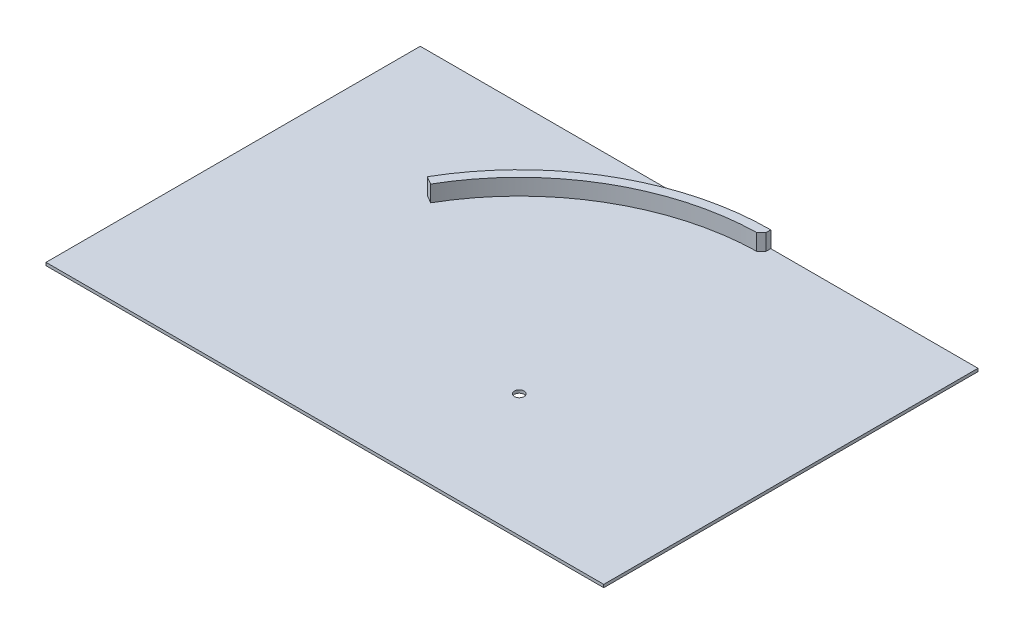
ISO-10303-21;
HEADER;
FILE_DESCRIPTION(('STEP AP214'),'2;1');
FILE_NAME('part.step','',(''),(''),'','','');
FILE_SCHEMA(('AUTOMOTIVE_DESIGN { 1 0 10303 214 1 1 1 1 }'));
ENDSEC;
DATA;
#1=APPLICATION_CONTEXT('core data for automotive mechanical design processes');
#2=APPLICATION_PROTOCOL_DEFINITION('international standard','automotive_design',2000,#1);
#3=PRODUCT_CONTEXT('',#1,'mechanical');
#4=PRODUCT('Part','Part','',(#3));
#5=PRODUCT_RELATED_PRODUCT_CATEGORY('part','',(#4));
#6=PRODUCT_DEFINITION_FORMATION('','',#4);
#7=PRODUCT_DEFINITION_CONTEXT('part definition',#1,'design');
#8=PRODUCT_DEFINITION('design','',#6,#7);
#9=PRODUCT_DEFINITION_SHAPE('','',#8);
#10=(LENGTH_UNIT() NAMED_UNIT(*) SI_UNIT(.MILLI.,.METRE.));
#11=(NAMED_UNIT(*) PLANE_ANGLE_UNIT() SI_UNIT($,.RADIAN.));
#12=(NAMED_UNIT(*) SI_UNIT($,.STERADIAN.) SOLID_ANGLE_UNIT());
#13=UNCERTAINTY_MEASURE_WITH_UNIT(LENGTH_MEASURE(1.E-05),#10,'distance_accuracy_value','');
#14=(GEOMETRIC_REPRESENTATION_CONTEXT(3) GLOBAL_UNCERTAINTY_ASSIGNED_CONTEXT((#13)) GLOBAL_UNIT_ASSIGNED_CONTEXT((#10,
#11,#12)) REPRESENTATION_CONTEXT('',''));
#15=CARTESIAN_POINT('',(0.,0.,0.));
#16=DIRECTION('',(0.,0.,1.));
#17=DIRECTION('',(1.,0.,0.));
#18=AXIS2_PLACEMENT_3D('',#15,#16,#17);
#19=CARTESIAN_POINT('',(0.,0.,0.));
#20=DIRECTION('',(0.,-1.,0.));
#21=DIRECTION('',(0.,0.,-1.));
#22=AXIS2_PLACEMENT_3D('',#19,#20,#21);
#23=PLANE('',#22);
#24=CARTESIAN_POINT('',(0.,0.,0.));
#25=DIRECTION('',(0.,-1.,0.));
#26=DIRECTION('',(0.,0.,1.));
#27=AXIS2_PLACEMENT_3D('',#24,#25,#26);
#28=CIRCLE('',#27,521.);
#29=CARTESIAN_POINT('',(-451.199235371692,0.,-260.5));
#30=VERTEX_POINT('',#29);
#31=CARTESIAN_POINT('',(-10.0978661013187,0.,-520.902133898681));
#32=VERTEX_POINT('',#31);
#33=EDGE_CURVE('E171',#30,#32,#28,.T.);
#34=ORIENTED_EDGE('',*,*,#33,.F.);
#35=DIRECTION('',(0.866025403784435,0.,0.500000000000006));
#36=VECTOR('',#35,1.);
#37=CARTESIAN_POINT('',(-468.519743447381,0.,-270.500000000001));
#38=LINE('',#37,#36);
#39=CARTESIAN_POINT('',(-468.519743447381,0.,-270.500000000001));
#40=VERTEX_POINT('',#39);
#41=EDGE_CURVE('E181',#40,#30,#38,.T.);
#42=ORIENTED_EDGE('',*,*,#41,.F.);
#43=CARTESIAN_POINT('',(0.,0.,0.));
#44=DIRECTION('',(0.,1.,0.));
#45=DIRECTION('',(0.,0.,1.));
#46=AXIS2_PLACEMENT_3D('',#43,#44,#45);
#47=CIRCLE('',#46,541.);
#48=CARTESIAN_POINT('',(0.,0.,-541.));
#49=VERTEX_POINT('',#48);
#50=EDGE_CURVE('E196',#49,#40,#47,.T.);
#51=ORIENTED_EDGE('',*,*,#50,.F.);
#52=DIRECTION('',(-1.,0.,0.));
#53=VECTOR('',#52,1.);
#54=CARTESIAN_POINT('',(-754.139235371692,0.,-541.));
#55=LINE('',#54,#53);
#56=CARTESIAN_POINT('',(-754.139235371692,0.,-541.));
#57=VERTEX_POINT('',#56);
#58=EDGE_CURVE('E150',#49,#57,#55,.T.);
#59=ORIENTED_EDGE('',*,*,#58,.T.);
#60=DIRECTION('',(0.,0.,1.));
#61=VECTOR('',#60,1.);
#62=CARTESIAN_POINT('',(-754.139235371692,0.,264.2));
#63=LINE('',#62,#61);
#64=CARTESIAN_POINT('',(-754.139235371692,0.,264.2));
#65=VERTEX_POINT('',#64);
#66=EDGE_CURVE('E160',#57,#65,#63,.T.);
#67=ORIENTED_EDGE('',*,*,#66,.T.);
#68=DIRECTION('',(1.,0.,0.));
#69=VECTOR('',#68,1.);
#70=CARTESIAN_POINT('',(-754.139235371692,0.,264.2));
#71=LINE('',#70,#69);
#72=CARTESIAN_POINT('',(445.860764628308,0.,264.2));
#73=VERTEX_POINT('',#72);
#74=EDGE_CURVE('E122',#65,#73,#71,.T.);
#75=ORIENTED_EDGE('',*,*,#74,.T.);
#76=DIRECTION('',(0.,0.,-1.));
#77=VECTOR('',#76,1.);
#78=CARTESIAN_POINT('',(445.860764628308,0.,264.2));
#79=LINE('',#78,#77);
#80=CARTESIAN_POINT('',(445.860764628308,0.,-541.));
#81=VERTEX_POINT('',#80);
#82=EDGE_CURVE('E165',#73,#81,#79,.T.);
#83=ORIENTED_EDGE('',*,*,#82,.T.);
#84=EDGE_CURVE('E146',#81,#49,#55,.T.);
#85=ORIENTED_EDGE('',*,*,#84,.T.);
#86=DIRECTION('',(0.,0.,-1.));
#87=VECTOR('',#86,1.);
#88=CARTESIAN_POINT('',(0.,0.,-541.));
#89=LINE('',#88,#87);
#90=CARTESIAN_POINT('',(0.,0.,-531.));
#91=VERTEX_POINT('',#90);
#92=EDGE_CURVE('E193',#91,#49,#89,.T.);
#93=ORIENTED_EDGE('',*,*,#92,.F.);
#94=DIRECTION('',(0.70710678118654,0.,-0.707106781186555));
#95=VECTOR('',#94,1.);
#96=CARTESIAN_POINT('',(-265.5,0.,-265.499999999995));
#97=LINE('',#96,#95);
#98=EDGE_CURVE('E11',#91,#32,#97,.F.);
#99=ORIENTED_EDGE('',*,*,#98,.T.);
#100=EDGE_LOOP('',(#34,#42,#51,#59,#67,#75,#83,#85,#93,#99));
#101=FACE_BOUND('',#100,.T.);
#102=CARTESIAN_POINT('',(0.,0.,0.));
#103=DIRECTION('',(0.,1.,0.));
#104=DIRECTION('',(0.,0.,1.));
#105=AXIS2_PLACEMENT_3D('',#102,#103,#104);
#106=CIRCLE('',#105,10.5);
#107=CARTESIAN_POINT('',(0.,0.,10.5));
#108=VERTEX_POINT('',#107);
#109=EDGE_CURVE('E382',#108,#108,#106,.T.);
#110=ORIENTED_EDGE('',*,*,#109,.F.);
#111=EDGE_LOOP('',(#110));
#112=FACE_BOUND('',#111,.T.);
#113=ADVANCED_FACE('F45',(#101,#112),#23,.F.);
#114=CARTESIAN_POINT('',(0.,35.,0.));
#115=DIRECTION('',(0.,-1.,0.));
#116=DIRECTION('',(0.,0.,-1.));
#117=AXIS2_PLACEMENT_3D('',#114,#115,#116);
#118=CYLINDRICAL_SURFACE('',#117,521.);
#119=ORIENTED_EDGE('',*,*,#33,.T.);
#120=DIRECTION('',(0.,-1.,0.));
#121=VECTOR('',#120,1.);
#122=CARTESIAN_POINT('',(-10.0978661013187,35.,-520.902133898681));
#123=LINE('',#122,#121);
#124=CARTESIAN_POINT('',(-10.0978661013187,35.,-520.902133898681));
#125=VERTEX_POINT('',#124);
#126=EDGE_CURVE('E62',#32,#125,#123,.F.);
#127=ORIENTED_EDGE('',*,*,#126,.T.);
#128=CARTESIAN_POINT('',(0.,35.,0.));
#129=DIRECTION('',(0.,-1.,0.));
#130=DIRECTION('',(0.,0.,1.));
#131=AXIS2_PLACEMENT_3D('',#128,#129,#130);
#132=CIRCLE('',#131,521.);
#133=CARTESIAN_POINT('',(-451.199235371692,35.,-260.5));
#134=VERTEX_POINT('',#133);
#135=EDGE_CURVE('E177',#134,#125,#132,.T.);
#136=ORIENTED_EDGE('',*,*,#135,.F.);
#137=DIRECTION('',(0.,-1.,0.));
#138=VECTOR('',#137,1.);
#139=CARTESIAN_POINT('',(-451.199235371692,35.,-260.5));
#140=LINE('',#139,#138);
#141=EDGE_CURVE('E190',#134,#30,#140,.T.);
#142=ORIENTED_EDGE('',*,*,#141,.T.);
#143=EDGE_LOOP('',(#119,#127,#136,#142));
#144=FACE_BOUND('',#143,.T.);
#145=ADVANCED_FACE('F241',(#144),#118,.F.);
#146=CARTESIAN_POINT('',(0.,35.,-541.));
#147=DIRECTION('',(-1.,0.,0.));
#148=DIRECTION('',(0.,0.,1.));
#149=AXIS2_PLACEMENT_3D('',#146,#147,#148);
#150=PLANE('',#149);
#151=DIRECTION('',(0.,0.,-1.));
#152=VECTOR('',#151,1.);
#153=CARTESIAN_POINT('',(0.,35.,-541.));
#154=LINE('',#153,#152);
#155=CARTESIAN_POINT('',(0.,35.,-531.));
#156=VERTEX_POINT('',#155);
#157=CARTESIAN_POINT('',(0.,35.,-541.));
#158=VERTEX_POINT('',#157);
#159=EDGE_CURVE('E180',#156,#158,#154,.T.);
#160=ORIENTED_EDGE('',*,*,#159,.F.);
#161=DIRECTION('',(0.,-1.,0.));
#162=VECTOR('',#161,1.);
#163=CARTESIAN_POINT('',(0.,35.,-531.));
#164=LINE('',#163,#162);
#165=EDGE_CURVE('E214',#156,#91,#164,.T.);
#166=ORIENTED_EDGE('',*,*,#165,.T.);
#167=ORIENTED_EDGE('',*,*,#92,.T.);
#168=DIRECTION('',(0.,-1.,0.));
#169=VECTOR('',#168,1.);
#170=CARTESIAN_POINT('',(0.,35.,-541.));
#171=LINE('',#170,#169);
#172=EDGE_CURVE('E210',#158,#49,#171,.T.);
#173=ORIENTED_EDGE('',*,*,#172,.F.);
#174=EDGE_LOOP('',(#160,#166,#167,#173));
#175=FACE_BOUND('',#174,.T.);
#176=ADVANCED_FACE('F228',(#175),#150,.F.);
#177=CARTESIAN_POINT('',(0.,35.,0.));
#178=DIRECTION('',(0.,-1.,0.));
#179=DIRECTION('',(0.,0.,-1.));
#180=AXIS2_PLACEMENT_3D('',#177,#178,#179);
#181=CYLINDRICAL_SURFACE('',#180,541.);
#182=ORIENTED_EDGE('',*,*,#50,.T.);
#183=DIRECTION('',(0.,-1.,0.));
#184=VECTOR('',#183,1.);
#185=CARTESIAN_POINT('',(-468.519743447381,35.,-270.500000000001));
#186=LINE('',#185,#184);
#187=CARTESIAN_POINT('',(-468.519743447381,35.,-270.500000000001));
#188=VERTEX_POINT('',#187);
#189=EDGE_CURVE('E206',#188,#40,#186,.T.);
#190=ORIENTED_EDGE('',*,*,#189,.F.);
#191=CARTESIAN_POINT('',(0.,35.,0.));
#192=DIRECTION('',(0.,1.,0.));
#193=DIRECTION('',(0.,0.,1.));
#194=AXIS2_PLACEMENT_3D('',#191,#192,#193);
#195=CIRCLE('',#194,541.);
#196=EDGE_CURVE('E184',#158,#188,#195,.T.);
#197=ORIENTED_EDGE('',*,*,#196,.F.);
#198=ORIENTED_EDGE('',*,*,#172,.T.);
#199=EDGE_LOOP('',(#182,#190,#197,#198));
#200=FACE_BOUND('',#199,.T.);
#201=ADVANCED_FACE('F265',(#200),#181,.T.);
#202=CARTESIAN_POINT('',(-468.519743447381,35.,-270.500000000001));
#203=DIRECTION('',(0.500000000000006,0.,-0.866025403784435));
#204=DIRECTION('',(-0.866025403784435,0.,-0.500000000000006));
#205=AXIS2_PLACEMENT_3D('',#202,#203,#204);
#206=PLANE('',#205);
#207=ORIENTED_EDGE('',*,*,#41,.T.);
#208=ORIENTED_EDGE('',*,*,#141,.F.);
#209=DIRECTION('',(0.866025403784435,0.,0.500000000000006));
#210=VECTOR('',#209,1.);
#211=CARTESIAN_POINT('',(-468.519743447381,35.,-270.500000000001));
#212=LINE('',#211,#210);
#213=EDGE_CURVE('E187',#188,#134,#212,.T.);
#214=ORIENTED_EDGE('',*,*,#213,.F.);
#215=ORIENTED_EDGE('',*,*,#189,.T.);
#216=EDGE_LOOP('',(#207,#208,#214,#215));
#217=FACE_BOUND('',#216,.T.);
#218=ADVANCED_FACE('F262',(#217),#206,.F.);
#219=CARTESIAN_POINT('',(0.,35.,0.));
#220=DIRECTION('',(0.,1.,0.));
#221=DIRECTION('',(0.,0.,1.));
#222=AXIS2_PLACEMENT_3D('',#219,#220,#221);
#223=PLANE('',#222);
#224=ORIENTED_EDGE('',*,*,#135,.T.);
#225=DIRECTION('',(-0.70710678118654,0.,0.707106781186555));
#226=VECTOR('',#225,1.);
#227=CARTESIAN_POINT('',(-265.5,35.,-265.499999999995));
#228=LINE('',#227,#226);
#229=EDGE_CURVE('E55',#125,#156,#228,.F.);
#230=ORIENTED_EDGE('',*,*,#229,.T.);
#231=ORIENTED_EDGE('',*,*,#159,.T.);
#232=ORIENTED_EDGE('',*,*,#196,.T.);
#233=ORIENTED_EDGE('',*,*,#213,.T.);
#234=EDGE_LOOP('',(#224,#230,#231,#232,#233));
#235=FACE_BOUND('',#234,.T.);
#236=ADVANCED_FACE('F223',(#235),#223,.T.);
#237=CARTESIAN_POINT('',(-754.139235371692,-6.35,264.2));
#238=DIRECTION('',(-1.,0.,0.));
#239=DIRECTION('',(0.,0.,1.));
#240=AXIS2_PLACEMENT_3D('',#237,#238,#239);
#241=PLANE('',#240);
#242=ORIENTED_EDGE('',*,*,#66,.F.);
#243=DIRECTION('',(0.,1.,0.));
#244=VECTOR('',#243,1.);
#245=CARTESIAN_POINT('',(-754.139235371692,-6.35,-541.));
#246=LINE('',#245,#244);
#247=CARTESIAN_POINT('',(-754.139235371692,-6.35,-541.));
#248=VERTEX_POINT('',#247);
#249=EDGE_CURVE('E144',#248,#57,#246,.T.);
#250=ORIENTED_EDGE('',*,*,#249,.F.);
#251=DIRECTION('',(0.,0.,1.));
#252=VECTOR('',#251,1.);
#253=CARTESIAN_POINT('',(-754.139235371692,-6.35,264.2));
#254=LINE('',#253,#252);
#255=CARTESIAN_POINT('',(-754.139235371692,-6.35,264.2));
#256=VERTEX_POINT('',#255);
#257=EDGE_CURVE('E136',#248,#256,#254,.T.);
#258=ORIENTED_EDGE('',*,*,#257,.T.);
#259=DIRECTION('',(0.,1.,0.));
#260=VECTOR('',#259,1.);
#261=CARTESIAN_POINT('',(-754.139235371692,-6.35,264.2));
#262=LINE('',#261,#260);
#263=EDGE_CURVE('E117',#256,#65,#262,.T.);
#264=ORIENTED_EDGE('',*,*,#263,.T.);
#265=EDGE_LOOP('',(#242,#250,#258,#264));
#266=FACE_BOUND('',#265,.T.);
#267=ADVANCED_FACE('F142',(#266),#241,.T.);
#268=CARTESIAN_POINT('',(-754.139235371692,-6.35,-541.));
#269=DIRECTION('',(0.,0.,-1.));
#270=DIRECTION('',(-1.,0.,0.));
#271=AXIS2_PLACEMENT_3D('',#268,#269,#270);
#272=PLANE('',#271);
#273=ORIENTED_EDGE('',*,*,#84,.F.);
#274=DIRECTION('',(0.,1.,0.));
#275=VECTOR('',#274,1.);
#276=CARTESIAN_POINT('',(445.860764628308,-6.35,-541.));
#277=LINE('',#276,#275);
#278=CARTESIAN_POINT('',(445.860764628308,-6.35,-541.));
#279=VERTEX_POINT('',#278);
#280=EDGE_CURVE('E172',#279,#81,#277,.T.);
#281=ORIENTED_EDGE('',*,*,#280,.F.);
#282=DIRECTION('',(-1.,0.,0.));
#283=VECTOR('',#282,1.);
#284=CARTESIAN_POINT('',(-754.139235371692,-6.35,-541.));
#285=LINE('',#284,#283);
#286=EDGE_CURVE('E129',#279,#248,#285,.T.);
#287=ORIENTED_EDGE('',*,*,#286,.T.);
#288=ORIENTED_EDGE('',*,*,#249,.T.);
#289=ORIENTED_EDGE('',*,*,#58,.F.);
#290=EDGE_LOOP('',(#273,#281,#287,#288,#289));
#291=FACE_BOUND('',#290,.T.);
#292=ADVANCED_FACE('F248',(#291),#272,.T.);
#293=CARTESIAN_POINT('',(445.860764628308,-6.35,264.2));
#294=DIRECTION('',(1.,0.,0.));
#295=DIRECTION('',(0.,0.,-1.));
#296=AXIS2_PLACEMENT_3D('',#293,#294,#295);
#297=PLANE('',#296);
#298=ORIENTED_EDGE('',*,*,#82,.F.);
#299=DIRECTION('',(0.,1.,0.));
#300=VECTOR('',#299,1.);
#301=CARTESIAN_POINT('',(445.860764628308,-6.35,264.2));
#302=LINE('',#301,#300);
#303=CARTESIAN_POINT('',(445.860764628308,-6.35,264.2));
#304=VERTEX_POINT('',#303);
#305=EDGE_CURVE('E128',#304,#73,#302,.T.);
#306=ORIENTED_EDGE('',*,*,#305,.F.);
#307=DIRECTION('',(0.,0.,-1.));
#308=VECTOR('',#307,1.);
#309=CARTESIAN_POINT('',(445.860764628308,-6.35,264.2));
#310=LINE('',#309,#308);
#311=EDGE_CURVE('E139',#304,#279,#310,.T.);
#312=ORIENTED_EDGE('',*,*,#311,.T.);
#313=ORIENTED_EDGE('',*,*,#280,.T.);
#314=EDGE_LOOP('',(#298,#306,#312,#313));
#315=FACE_BOUND('',#314,.T.);
#316=ADVANCED_FACE('F251',(#315),#297,.T.);
#317=CARTESIAN_POINT('',(-754.139235371692,-6.35,264.2));
#318=DIRECTION('',(0.,0.,1.));
#319=DIRECTION('',(1.,0.,0.));
#320=AXIS2_PLACEMENT_3D('',#317,#318,#319);
#321=PLANE('',#320);
#322=ORIENTED_EDGE('',*,*,#74,.F.);
#323=ORIENTED_EDGE('',*,*,#263,.F.);
#324=DIRECTION('',(1.,0.,0.));
#325=VECTOR('',#324,1.);
#326=CARTESIAN_POINT('',(-754.139235371692,-6.35,264.2));
#327=LINE('',#326,#325);
#328=EDGE_CURVE('E120',#256,#304,#327,.T.);
#329=ORIENTED_EDGE('',*,*,#328,.T.);
#330=ORIENTED_EDGE('',*,*,#305,.T.);
#331=EDGE_LOOP('',(#322,#323,#329,#330));
#332=FACE_BOUND('',#331,.T.);
#333=ADVANCED_FACE('F119',(#332),#321,.T.);
#334=CARTESIAN_POINT('',(0.,-6.35,0.));
#335=DIRECTION('',(0.,-1.,0.));
#336=DIRECTION('',(0.,0.,-1.));
#337=AXIS2_PLACEMENT_3D('',#334,#335,#336);
#338=PLANE('',#337);
#339=CARTESIAN_POINT('',(0.,-6.35,0.));
#340=DIRECTION('',(0.,1.,0.));
#341=DIRECTION('',(0.,0.,1.));
#342=AXIS2_PLACEMENT_3D('',#339,#340,#341);
#343=CIRCLE('',#342,10.5);
#344=CARTESIAN_POINT('',(0.,-6.35,10.5));
#345=VERTEX_POINT('',#344);
#346=EDGE_CURVE('E153',#345,#345,#343,.T.);
#347=ORIENTED_EDGE('',*,*,#346,.T.);
#348=EDGE_LOOP('',(#347));
#349=FACE_BOUND('',#348,.T.);
#350=ORIENTED_EDGE('',*,*,#257,.F.);
#351=ORIENTED_EDGE('',*,*,#286,.F.);
#352=ORIENTED_EDGE('',*,*,#311,.F.);
#353=ORIENTED_EDGE('',*,*,#328,.F.);
#354=EDGE_LOOP('',(#350,#351,#352,#353));
#355=FACE_BOUND('',#354,.T.);
#356=ADVANCED_FACE('F134',(#349,#355),#338,.T.);
#357=CARTESIAN_POINT('',(0.,35.,-531.));
#358=DIRECTION('',(-0.707106781186555,0.,-0.70710678118654));
#359=DIRECTION('',(0.,-1.,0.));
#360=AXIS2_PLACEMENT_3D('',#357,#358,#359);
#361=PLANE('',#360);
#362=ORIENTED_EDGE('',*,*,#229,.F.);
#363=ORIENTED_EDGE('',*,*,#126,.F.);
#364=ORIENTED_EDGE('',*,*,#98,.F.);
#365=ORIENTED_EDGE('',*,*,#165,.F.);
#366=EDGE_LOOP('',(#362,#363,#364,#365));
#367=FACE_BOUND('',#366,.T.);
#368=ADVANCED_FACE('F48',(#367),#361,.F.);
#369=CARTESIAN_POINT('',(0.,0.,0.));
#370=DIRECTION('',(0.,1.,0.));
#371=DIRECTION('',(0.,0.,1.));
#372=AXIS2_PLACEMENT_3D('',#369,#370,#371);
#373=CYLINDRICAL_SURFACE('',#372,10.5);
#374=ORIENTED_EDGE('',*,*,#346,.F.);
#375=EDGE_LOOP('',(#374));
#376=FACE_BOUND('',#375,.T.);
#377=ORIENTED_EDGE('',*,*,#109,.T.);
#378=EDGE_LOOP('',(#377));
#379=FACE_BOUND('',#378,.T.);
#380=ADVANCED_FACE('F231',(#376,#379),#373,.F.);
#381=CLOSED_SHELL('',(#113,#145,#176,#201,#218,#236,#267,#292,#316,#333,#356,#368,#380));
#382=MANIFOLD_SOLID_BREP('B2',#381);
#383=ADVANCED_BREP_SHAPE_REPRESENTATION('',(#18,#382),#14);
#384=SHAPE_DEFINITION_REPRESENTATION(#9,#383);
ENDSEC;
END-ISO-10303-21;
